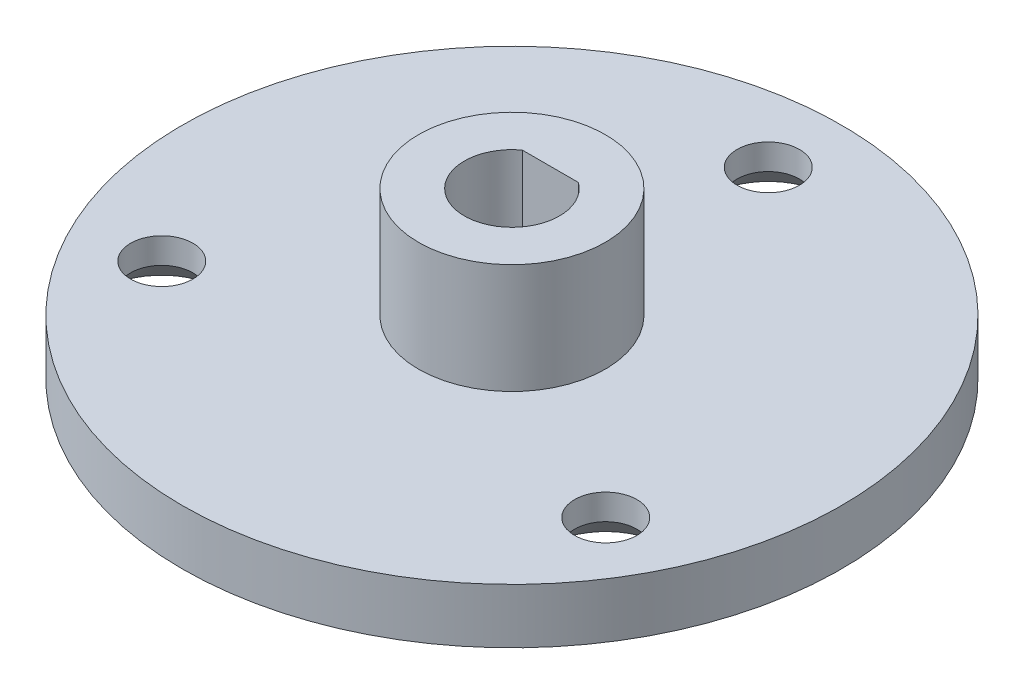
ISO-10303-21;
HEADER;
FILE_DESCRIPTION(('STEP AP214'),'2;1');
FILE_NAME('part.step','',(''),(''),'','','');
FILE_SCHEMA(('AUTOMOTIVE_DESIGN { 1 0 10303 214 1 1 1 1 }'));
ENDSEC;
DATA;
#1=APPLICATION_CONTEXT('core data for automotive mechanical design processes');
#2=APPLICATION_PROTOCOL_DEFINITION('international standard','automotive_design',2000,#1);
#3=PRODUCT_CONTEXT('',#1,'mechanical');
#4=PRODUCT('Part','Part','',(#3));
#5=PRODUCT_RELATED_PRODUCT_CATEGORY('part','',(#4));
#6=PRODUCT_DEFINITION_FORMATION('','',#4);
#7=PRODUCT_DEFINITION_CONTEXT('part definition',#1,'design');
#8=PRODUCT_DEFINITION('design','',#6,#7);
#9=PRODUCT_DEFINITION_SHAPE('','',#8);
#10=(LENGTH_UNIT() NAMED_UNIT(*) SI_UNIT(.MILLI.,.METRE.));
#11=(NAMED_UNIT(*) PLANE_ANGLE_UNIT() SI_UNIT($,.RADIAN.));
#12=(NAMED_UNIT(*) SI_UNIT($,.STERADIAN.) SOLID_ANGLE_UNIT());
#13=UNCERTAINTY_MEASURE_WITH_UNIT(LENGTH_MEASURE(1.E-05),#10,'distance_accuracy_value','');
#14=(GEOMETRIC_REPRESENTATION_CONTEXT(3) GLOBAL_UNCERTAINTY_ASSIGNED_CONTEXT((#13)) GLOBAL_UNIT_ASSIGNED_CONTEXT((#10,
#11,#12)) REPRESENTATION_CONTEXT('',''));
#15=CARTESIAN_POINT('',(0.,0.,0.));
#16=DIRECTION('',(0.,0.,1.));
#17=DIRECTION('',(1.,0.,0.));
#18=AXIS2_PLACEMENT_3D('',#15,#16,#17);
#19=CARTESIAN_POINT('',(0.,3.,0.));
#20=DIRECTION('',(0.,1.,0.));
#21=DIRECTION('',(0.,0.,1.));
#22=AXIS2_PLACEMENT_3D('',#19,#20,#21);
#23=PLANE('',#22);
#24=CARTESIAN_POINT('',(0.,3.,0.));
#25=DIRECTION('',(0.,1.,0.));
#26=DIRECTION('',(0.,0.,1.));
#27=AXIS2_PLACEMENT_3D('',#24,#25,#26);
#28=CIRCLE('',#27,18.);
#29=CARTESIAN_POINT('',(0.,3.,18.));
#30=VERTEX_POINT('',#29);
#31=EDGE_CURVE('E122',#30,#30,#28,.T.);
#32=ORIENTED_EDGE('',*,*,#31,.T.);
#33=EDGE_LOOP('',(#32));
#34=FACE_BOUND('',#33,.T.);
#35=CARTESIAN_POINT('',(0.,3.,-14.));
#36=DIRECTION('',(0.,-1.,0.));
#37=DIRECTION('',(0.,0.,-1.));
#38=AXIS2_PLACEMENT_3D('',#35,#36,#37);
#39=CIRCLE('',#38,1.69999999999999);
#40=CARTESIAN_POINT('',(0.,3.,-15.7));
#41=VERTEX_POINT('',#40);
#42=EDGE_CURVE('E118',#41,#41,#39,.T.);
#43=ORIENTED_EDGE('',*,*,#42,.T.);
#44=EDGE_LOOP('',(#43));
#45=FACE_BOUND('',#44,.T.);
#46=CARTESIAN_POINT('',(-12.1243556529821,3.,7.00000000000006));
#47=DIRECTION('',(0.,-1.,0.));
#48=DIRECTION('',(0.,0.,-1.));
#49=AXIS2_PLACEMENT_3D('',#46,#47,#48);
#50=CIRCLE('',#49,1.69999999999999);
#51=CARTESIAN_POINT('',(-12.1243556529821,3.,5.30000000000007));
#52=VERTEX_POINT('',#51);
#53=EDGE_CURVE('E106',#52,#52,#50,.T.);
#54=ORIENTED_EDGE('',*,*,#53,.T.);
#55=EDGE_LOOP('',(#54));
#56=FACE_BOUND('',#55,.T.);
#57=CARTESIAN_POINT('',(12.1243556529822,3.,6.99999999999993));
#58=DIRECTION('',(0.,-1.,0.));
#59=DIRECTION('',(0.,0.,-1.));
#60=AXIS2_PLACEMENT_3D('',#57,#58,#59);
#61=CIRCLE('',#60,1.69999999999999);
#62=CARTESIAN_POINT('',(12.1243556529822,3.,5.29999999999995));
#63=VERTEX_POINT('',#62);
#64=EDGE_CURVE('E94',#63,#63,#61,.T.);
#65=ORIENTED_EDGE('',*,*,#64,.T.);
#66=EDGE_LOOP('',(#65));
#67=FACE_BOUND('',#66,.T.);
#68=CARTESIAN_POINT('',(0.,3.,0.));
#69=DIRECTION('',(0.,1.,0.));
#70=DIRECTION('',(0.,0.,1.));
#71=AXIS2_PLACEMENT_3D('',#68,#69,#70);
#72=CIRCLE('',#71,5.1);
#73=CARTESIAN_POINT('',(0.,3.,5.1));
#74=VERTEX_POINT('',#73);
#75=EDGE_CURVE('E73',#74,#74,#72,.T.);
#76=ORIENTED_EDGE('',*,*,#75,.F.);
#77=EDGE_LOOP('',(#76));
#78=FACE_BOUND('',#77,.T.);
#79=ADVANCED_FACE('F39',(#34,#45,#56,#67,#78),#23,.T.);
#80=CARTESIAN_POINT('',(0.,3.,0.));
#81=DIRECTION('',(0.,-1.,0.));
#82=DIRECTION('',(0.,0.,-1.));
#83=AXIS2_PLACEMENT_3D('',#80,#81,#82);
#84=CYLINDRICAL_SURFACE('',#83,2.6);
#85=CARTESIAN_POINT('',(0.,0.,0.));
#86=DIRECTION('',(0.,1.,0.));
#87=DIRECTION('',(0.,0.,1.));
#88=AXIS2_PLACEMENT_3D('',#85,#86,#87);
#89=CIRCLE('',#88,2.6);
#90=CARTESIAN_POINT('',(-1.53297097167559,0.,-2.1));
#91=VERTEX_POINT('',#90);
#92=CARTESIAN_POINT('',(1.53297097167559,0.,-2.1));
#93=VERTEX_POINT('',#92);
#94=EDGE_CURVE('E68',#91,#93,#89,.T.);
#95=ORIENTED_EDGE('',*,*,#94,.F.);
#96=DIRECTION('',(0.,-1.,0.));
#97=VECTOR('',#96,1.);
#98=CARTESIAN_POINT('',(-1.53297097167559,3.,-2.1));
#99=LINE('',#98,#97);
#100=CARTESIAN_POINT('',(-1.53297097167559,9.,-2.1));
#101=VERTEX_POINT('',#100);
#102=EDGE_CURVE('E11',#101,#91,#99,.T.);
#103=ORIENTED_EDGE('',*,*,#102,.F.);
#104=CARTESIAN_POINT('',(0.,9.,0.));
#105=DIRECTION('',(0.,1.,0.));
#106=DIRECTION('',(0.,0.,1.));
#107=AXIS2_PLACEMENT_3D('',#104,#105,#106);
#108=CIRCLE('',#107,2.6);
#109=CARTESIAN_POINT('',(1.53297097167559,9.,-2.1));
#110=VERTEX_POINT('',#109);
#111=EDGE_CURVE('E65',#101,#110,#108,.T.);
#112=ORIENTED_EDGE('',*,*,#111,.T.);
#113=DIRECTION('',(0.,-1.,0.));
#114=VECTOR('',#113,1.);
#115=CARTESIAN_POINT('',(1.53297097167559,3.,-2.1));
#116=LINE('',#115,#114);
#117=EDGE_CURVE('E48',#110,#93,#116,.T.);
#118=ORIENTED_EDGE('',*,*,#117,.T.);
#119=EDGE_LOOP('',(#95,#103,#112,#118));
#120=FACE_BOUND('',#119,.T.);
#121=ADVANCED_FACE('F41',(#120),#84,.F.);
#122=CARTESIAN_POINT('',(0.,3.,-2.1));
#123=DIRECTION('',(0.,0.,-1.));
#124=DIRECTION('',(-1.,0.,0.));
#125=AXIS2_PLACEMENT_3D('',#122,#123,#124);
#126=PLANE('',#125);
#127=DIRECTION('',(1.,0.,0.));
#128=VECTOR('',#127,1.);
#129=CARTESIAN_POINT('',(0.,0.,-2.1));
#130=LINE('',#129,#128);
#131=EDGE_CURVE('E129',#91,#93,#130,.T.);
#132=ORIENTED_EDGE('',*,*,#131,.T.);
#133=ORIENTED_EDGE('',*,*,#117,.F.);
#134=DIRECTION('',(-1.,0.,0.));
#135=VECTOR('',#134,1.);
#136=CARTESIAN_POINT('',(-1.53297097167559,9.,-2.1));
#137=LINE('',#136,#135);
#138=EDGE_CURVE('E69',#110,#101,#137,.T.);
#139=ORIENTED_EDGE('',*,*,#138,.T.);
#140=ORIENTED_EDGE('',*,*,#102,.T.);
#141=EDGE_LOOP('',(#132,#133,#139,#140));
#142=FACE_BOUND('',#141,.T.);
#143=ADVANCED_FACE('F70',(#142),#126,.F.);
#144=CARTESIAN_POINT('',(0.,3.,0.));
#145=DIRECTION('',(0.,-1.,0.));
#146=DIRECTION('',(0.,0.,-1.));
#147=AXIS2_PLACEMENT_3D('',#144,#145,#146);
#148=CYLINDRICAL_SURFACE('',#147,18.);
#149=ORIENTED_EDGE('',*,*,#31,.F.);
#150=EDGE_LOOP('',(#149));
#151=FACE_BOUND('',#150,.T.);
#152=CARTESIAN_POINT('',(0.,0.,0.));
#153=DIRECTION('',(0.,1.,0.));
#154=DIRECTION('',(0.,0.,1.));
#155=AXIS2_PLACEMENT_3D('',#152,#153,#154);
#156=CIRCLE('',#155,18.);
#157=CARTESIAN_POINT('',(0.,0.,18.));
#158=VERTEX_POINT('',#157);
#159=EDGE_CURVE('E126',#158,#158,#156,.T.);
#160=ORIENTED_EDGE('',*,*,#159,.T.);
#161=EDGE_LOOP('',(#160));
#162=FACE_BOUND('',#161,.T.);
#163=ADVANCED_FACE('F137',(#151,#162),#148,.T.);
#164=CARTESIAN_POINT('',(0.,0.,0.));
#165=DIRECTION('',(0.,1.,0.));
#166=DIRECTION('',(0.,0.,1.));
#167=AXIS2_PLACEMENT_3D('',#164,#165,#166);
#168=PLANE('',#167);
#169=CARTESIAN_POINT('',(12.1243556529822,0.,6.99999999999993));
#170=DIRECTION('',(0.,-1.,0.));
#171=DIRECTION('',(0.,0.,-1.));
#172=AXIS2_PLACEMENT_3D('',#169,#170,#171);
#173=CIRCLE('',#172,3.3);
#174=CARTESIAN_POINT('',(12.1243556529822,0.,3.69999999999993));
#175=VERTEX_POINT('',#174);
#176=EDGE_CURVE('E83',#175,#175,#173,.T.);
#177=ORIENTED_EDGE('',*,*,#176,.F.);
#178=EDGE_LOOP('',(#177));
#179=FACE_BOUND('',#178,.T.);
#180=CARTESIAN_POINT('',(-12.1243556529821,0.,7.00000000000006));
#181=DIRECTION('',(0.,-1.,0.));
#182=DIRECTION('',(0.,0.,-1.));
#183=AXIS2_PLACEMENT_3D('',#180,#181,#182);
#184=CIRCLE('',#183,3.3);
#185=CARTESIAN_POINT('',(-12.1243556529821,0.,3.70000000000006));
#186=VERTEX_POINT('',#185);
#187=EDGE_CURVE('E98',#186,#186,#184,.T.);
#188=ORIENTED_EDGE('',*,*,#187,.F.);
#189=EDGE_LOOP('',(#188));
#190=FACE_BOUND('',#189,.T.);
#191=CARTESIAN_POINT('',(0.,0.,-14.));
#192=DIRECTION('',(0.,-1.,0.));
#193=DIRECTION('',(0.,0.,-1.));
#194=AXIS2_PLACEMENT_3D('',#191,#192,#193);
#195=CIRCLE('',#194,3.3);
#196=CARTESIAN_POINT('',(0.,0.,-17.3));
#197=VERTEX_POINT('',#196);
#198=EDGE_CURVE('E110',#197,#197,#195,.T.);
#199=ORIENTED_EDGE('',*,*,#198,.F.);
#200=EDGE_LOOP('',(#199));
#201=FACE_BOUND('',#200,.T.);
#202=ORIENTED_EDGE('',*,*,#94,.T.);
#203=ORIENTED_EDGE('',*,*,#131,.F.);
#204=EDGE_LOOP('',(#202,#203));
#205=FACE_BOUND('',#204,.T.);
#206=ORIENTED_EDGE('',*,*,#159,.F.);
#207=EDGE_LOOP('',(#206));
#208=FACE_BOUND('',#207,.T.);
#209=ADVANCED_FACE('F139',(#179,#190,#201,#205,#208),#168,.F.);
#210=CARTESIAN_POINT('',(0.,0.,-14.));
#211=DIRECTION('',(0.,-1.,0.));
#212=DIRECTION('',(0.,0.,-1.));
#213=AXIS2_PLACEMENT_3D('',#210,#211,#212);
#214=CYLINDRICAL_SURFACE('',#213,1.69999999999999);
#215=ORIENTED_EDGE('',*,*,#42,.F.);
#216=EDGE_LOOP('',(#215));
#217=FACE_BOUND('',#216,.T.);
#218=CARTESIAN_POINT('',(0.,1.6,-14.));
#219=DIRECTION('',(0.,-1.,0.));
#220=DIRECTION('',(0.,0.,-1.));
#221=AXIS2_PLACEMENT_3D('',#218,#219,#220);
#222=CIRCLE('',#221,1.69999999999999);
#223=CARTESIAN_POINT('',(0.,1.6,-15.7));
#224=VERTEX_POINT('',#223);
#225=EDGE_CURVE('E114',#224,#224,#222,.T.);
#226=ORIENTED_EDGE('',*,*,#225,.T.);
#227=EDGE_LOOP('',(#226));
#228=FACE_BOUND('',#227,.T.);
#229=ADVANCED_FACE('F141',(#217,#228),#214,.F.);
#230=CARTESIAN_POINT('',(0.,0.,-14.));
#231=DIRECTION('',(0.,-1.,0.));
#232=DIRECTION('',(0.,0.,-1.));
#233=AXIS2_PLACEMENT_3D('',#230,#231,#232);
#234=CONICAL_SURFACE('',#233,3.3,0.78539816339745);
#235=ORIENTED_EDGE('',*,*,#225,.F.);
#236=EDGE_LOOP('',(#235));
#237=FACE_BOUND('',#236,.T.);
#238=ORIENTED_EDGE('',*,*,#198,.T.);
#239=EDGE_LOOP('',(#238));
#240=FACE_BOUND('',#239,.T.);
#241=ADVANCED_FACE('F148',(#237,#240),#234,.F.);
#242=CARTESIAN_POINT('',(-12.1243556529821,0.,7.00000000000006));
#243=DIRECTION('',(0.,-1.,0.));
#244=DIRECTION('',(0.,0.,-1.));
#245=AXIS2_PLACEMENT_3D('',#242,#243,#244);
#246=CYLINDRICAL_SURFACE('',#245,1.69999999999999);
#247=ORIENTED_EDGE('',*,*,#53,.F.);
#248=EDGE_LOOP('',(#247));
#249=FACE_BOUND('',#248,.T.);
#250=CARTESIAN_POINT('',(-12.1243556529821,1.6,7.00000000000006));
#251=DIRECTION('',(0.,-1.,0.));
#252=DIRECTION('',(0.,0.,-1.));
#253=AXIS2_PLACEMENT_3D('',#250,#251,#252);
#254=CIRCLE('',#253,1.69999999999999);
#255=CARTESIAN_POINT('',(-12.1243556529821,1.6,5.30000000000007));
#256=VERTEX_POINT('',#255);
#257=EDGE_CURVE('E102',#256,#256,#254,.T.);
#258=ORIENTED_EDGE('',*,*,#257,.T.);
#259=EDGE_LOOP('',(#258));
#260=FACE_BOUND('',#259,.T.);
#261=ADVANCED_FACE('F165',(#249,#260),#246,.F.);
#262=CARTESIAN_POINT('',(-12.1243556529821,0.,7.00000000000006));
#263=DIRECTION('',(0.,-1.,0.));
#264=DIRECTION('',(0.,0.,-1.));
#265=AXIS2_PLACEMENT_3D('',#262,#263,#264);
#266=CONICAL_SURFACE('',#265,3.3,0.78539816339745);
#267=ORIENTED_EDGE('',*,*,#257,.F.);
#268=EDGE_LOOP('',(#267));
#269=FACE_BOUND('',#268,.T.);
#270=ORIENTED_EDGE('',*,*,#187,.T.);
#271=EDGE_LOOP('',(#270));
#272=FACE_BOUND('',#271,.T.);
#273=ADVANCED_FACE('F169',(#269,#272),#266,.F.);
#274=CARTESIAN_POINT('',(12.1243556529822,0.,6.99999999999993));
#275=DIRECTION('',(0.,-1.,0.));
#276=DIRECTION('',(0.,0.,-1.));
#277=AXIS2_PLACEMENT_3D('',#274,#275,#276);
#278=CYLINDRICAL_SURFACE('',#277,1.69999999999999);
#279=ORIENTED_EDGE('',*,*,#64,.F.);
#280=EDGE_LOOP('',(#279));
#281=FACE_BOUND('',#280,.T.);
#282=CARTESIAN_POINT('',(12.1243556529822,1.6,6.99999999999993));
#283=DIRECTION('',(0.,-1.,0.));
#284=DIRECTION('',(0.,0.,-1.));
#285=AXIS2_PLACEMENT_3D('',#282,#283,#284);
#286=CIRCLE('',#285,1.69999999999999);
#287=CARTESIAN_POINT('',(12.1243556529822,1.6,5.29999999999995));
#288=VERTEX_POINT('',#287);
#289=EDGE_CURVE('E90',#288,#288,#286,.T.);
#290=ORIENTED_EDGE('',*,*,#289,.T.);
#291=EDGE_LOOP('',(#290));
#292=FACE_BOUND('',#291,.T.);
#293=ADVANCED_FACE('F173',(#281,#292),#278,.F.);
#294=CARTESIAN_POINT('',(12.1243556529822,0.,6.99999999999993));
#295=DIRECTION('',(0.,-1.,0.));
#296=DIRECTION('',(0.,0.,-1.));
#297=AXIS2_PLACEMENT_3D('',#294,#295,#296);
#298=CONICAL_SURFACE('',#297,3.3,0.78539816339745);
#299=ORIENTED_EDGE('',*,*,#289,.F.);
#300=EDGE_LOOP('',(#299));
#301=FACE_BOUND('',#300,.T.);
#302=ORIENTED_EDGE('',*,*,#176,.T.);
#303=EDGE_LOOP('',(#302));
#304=FACE_BOUND('',#303,.T.);
#305=ADVANCED_FACE('F177',(#301,#304),#298,.F.);
#306=CARTESIAN_POINT('',(0.,9.,0.));
#307=DIRECTION('',(0.,1.,0.));
#308=DIRECTION('',(0.,0.,1.));
#309=AXIS2_PLACEMENT_3D('',#306,#307,#308);
#310=PLANE('',#309);
#311=CARTESIAN_POINT('',(0.,9.,0.));
#312=DIRECTION('',(0.,1.,0.));
#313=DIRECTION('',(0.,0.,1.));
#314=AXIS2_PLACEMENT_3D('',#311,#312,#313);
#315=CIRCLE('',#314,5.1);
#316=CARTESIAN_POINT('',(0.,9.,5.1));
#317=VERTEX_POINT('',#316);
#318=EDGE_CURVE('E79',#317,#317,#315,.T.);
#319=ORIENTED_EDGE('',*,*,#318,.T.);
#320=EDGE_LOOP('',(#319));
#321=FACE_BOUND('',#320,.T.);
#322=ORIENTED_EDGE('',*,*,#138,.F.);
#323=ORIENTED_EDGE('',*,*,#111,.F.);
#324=EDGE_LOOP('',(#322,#323));
#325=FACE_BOUND('',#324,.T.);
#326=ADVANCED_FACE('F75',(#321,#325),#310,.T.);
#327=CARTESIAN_POINT('',(0.,9.,0.));
#328=DIRECTION('',(0.,-1.,0.));
#329=DIRECTION('',(0.,0.,-1.));
#330=AXIS2_PLACEMENT_3D('',#327,#328,#329);
#331=CYLINDRICAL_SURFACE('',#330,5.1);
#332=ORIENTED_EDGE('',*,*,#318,.F.);
#333=EDGE_LOOP('',(#332));
#334=FACE_BOUND('',#333,.T.);
#335=ORIENTED_EDGE('',*,*,#75,.T.);
#336=EDGE_LOOP('',(#335));
#337=FACE_BOUND('',#336,.T.);
#338=ADVANCED_FACE('F182',(#334,#337),#331,.T.);
#339=CLOSED_SHELL('',(#79,#121,#143,#163,#209,#229,#241,#261,#273,#293,#305,#326,#338));
#340=MANIFOLD_SOLID_BREP('B2',#339);
#341=ADVANCED_BREP_SHAPE_REPRESENTATION('',(#18,#340),#14);
#342=SHAPE_DEFINITION_REPRESENTATION(#9,#341);
ENDSEC;
END-ISO-10303-21;
